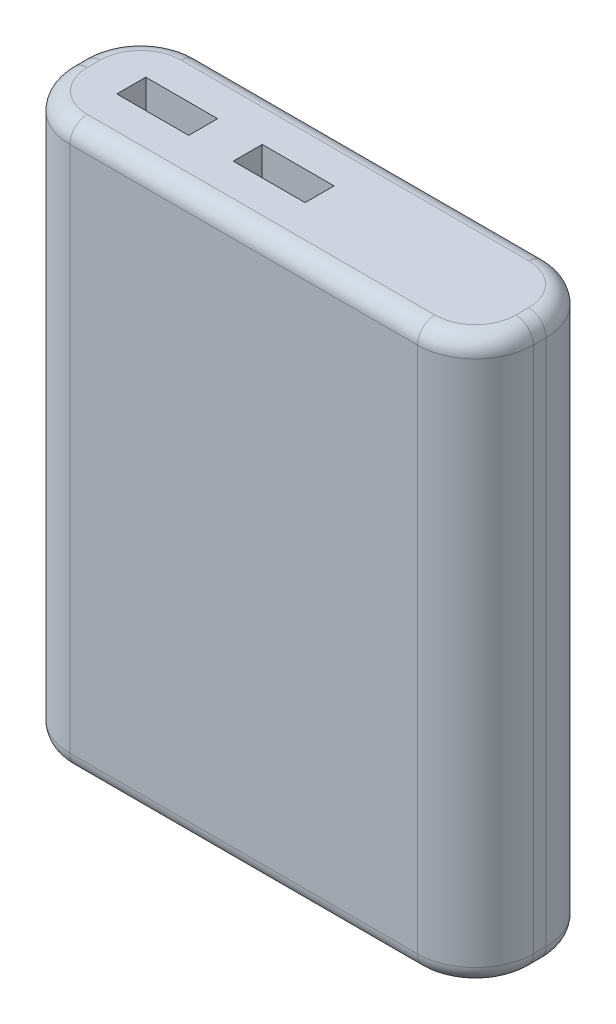
ISO-10303-21;
HEADER;
FILE_DESCRIPTION(('STEP AP214'),'2;1');
FILE_NAME('part.step','',(''),(''),'','','');
FILE_SCHEMA(('AUTOMOTIVE_DESIGN { 1 0 10303 214 1 1 1 1 }'));
ENDSEC;
DATA;
#1=APPLICATION_CONTEXT('core data for automotive mechanical design processes');
#2=APPLICATION_PROTOCOL_DEFINITION('international standard','automotive_design',2000,#1);
#3=PRODUCT_CONTEXT('',#1,'mechanical');
#4=PRODUCT('Part','Part','',(#3));
#5=PRODUCT_RELATED_PRODUCT_CATEGORY('part','',(#4));
#6=PRODUCT_DEFINITION_FORMATION('','',#4);
#7=PRODUCT_DEFINITION_CONTEXT('part definition',#1,'design');
#8=PRODUCT_DEFINITION('design','',#6,#7);
#9=PRODUCT_DEFINITION_SHAPE('','',#8);
#10=(LENGTH_UNIT() NAMED_UNIT(*) SI_UNIT(.MILLI.,.METRE.));
#11=(NAMED_UNIT(*) PLANE_ANGLE_UNIT() SI_UNIT($,.RADIAN.));
#12=(NAMED_UNIT(*) SI_UNIT($,.STERADIAN.) SOLID_ANGLE_UNIT());
#13=UNCERTAINTY_MEASURE_WITH_UNIT(LENGTH_MEASURE(1.E-05),#10,'distance_accuracy_value','');
#14=(GEOMETRIC_REPRESENTATION_CONTEXT(3) GLOBAL_UNCERTAINTY_ASSIGNED_CONTEXT((#13)) GLOBAL_UNIT_ASSIGNED_CONTEXT((#10,
#11,#12)) REPRESENTATION_CONTEXT('',''));
#15=CARTESIAN_POINT('',(0.,0.,0.));
#16=DIRECTION('',(0.,0.,1.));
#17=DIRECTION('',(1.,0.,0.));
#18=AXIS2_PLACEMENT_3D('',#15,#16,#17);
#19=CARTESIAN_POINT('',(30.,97.,1.1));
#20=DIRECTION('',(0.,-1.,0.));
#21=DIRECTION('',(0.,0.,-1.));
#22=AXIS2_PLACEMENT_3D('',#19,#20,#21);
#23=CYLINDRICAL_SURFACE('',#22,10.);
#24=DIRECTION('',(0.,-1.,0.));
#25=VECTOR('',#24,1.);
#26=CARTESIAN_POINT('',(40.,97.,1.09999999999993));
#27=LINE('',#26,#25);
#28=CARTESIAN_POINT('',(40.,94.,1.09999999999993));
#29=VERTEX_POINT('',#28);
#30=CARTESIAN_POINT('',(40.,3.00000000000002,1.09999999999993));
#31=VERTEX_POINT('',#30);
#32=EDGE_CURVE('E286',#29,#31,#27,.T.);
#33=ORIENTED_EDGE('',*,*,#32,.F.);
#34=CARTESIAN_POINT('',(30.,94.,1.1));
#35=DIRECTION('',(0.,1.,0.));
#36=DIRECTION('',(0.,0.,1.));
#37=AXIS2_PLACEMENT_3D('',#34,#35,#36);
#38=CIRCLE('',#37,10.);
#39=CARTESIAN_POINT('',(29.9999999999999,94.,11.1));
#40=VERTEX_POINT('',#39);
#41=EDGE_CURVE('E338',#29,#40,#38,.F.);
#42=ORIENTED_EDGE('',*,*,#41,.T.);
#43=DIRECTION('',(0.,-1.,0.));
#44=VECTOR('',#43,1.);
#45=CARTESIAN_POINT('',(29.9999999999999,97.,11.1));
#46=LINE('',#45,#44);
#47=CARTESIAN_POINT('',(29.9999999999999,3.00000000000002,11.1));
#48=VERTEX_POINT('',#47);
#49=EDGE_CURVE('E264',#40,#48,#46,.T.);
#50=ORIENTED_EDGE('',*,*,#49,.T.);
#51=CARTESIAN_POINT('',(30.,2.99999999999999,1.1));
#52=DIRECTION('',(0.,1.,0.));
#53=DIRECTION('',(0.,0.,1.));
#54=AXIS2_PLACEMENT_3D('',#51,#52,#53);
#55=CIRCLE('',#54,10.);
#56=EDGE_CURVE('E336',#48,#31,#55,.T.);
#57=ORIENTED_EDGE('',*,*,#56,.T.);
#58=EDGE_LOOP('',(#33,#42,#50,#57));
#59=FACE_BOUND('',#58,.T.);
#60=ADVANCED_FACE('F32',(#59),#23,.T.);
#61=CARTESIAN_POINT('',(40.,97.,-1.09999999999993));
#62=DIRECTION('',(-1.,0.,0.));
#63=DIRECTION('',(0.,0.,1.));
#64=AXIS2_PLACEMENT_3D('',#61,#62,#63);
#65=PLANE('',#64);
#66=DIRECTION('',(0.,-1.,0.));
#67=VECTOR('',#66,1.);
#68=CARTESIAN_POINT('',(40.,97.,-1.09999999999993));
#69=LINE('',#68,#67);
#70=CARTESIAN_POINT('',(40.,94.,-1.09999999999993));
#71=VERTEX_POINT('',#70);
#72=CARTESIAN_POINT('',(40.,3.00000000000002,-1.09999999999993));
#73=VERTEX_POINT('',#72);
#74=EDGE_CURVE('E283',#71,#73,#69,.T.);
#75=ORIENTED_EDGE('',*,*,#74,.F.);
#76=DIRECTION('',(0.,0.,-1.));
#77=VECTOR('',#76,1.);
#78=CARTESIAN_POINT('',(40.,94.,1.09999999999993));
#79=LINE('',#78,#77);
#80=EDGE_CURVE('E334',#71,#29,#79,.F.);
#81=ORIENTED_EDGE('',*,*,#80,.T.);
#82=ORIENTED_EDGE('',*,*,#32,.T.);
#83=DIRECTION('',(0.,0.,-1.));
#84=VECTOR('',#83,1.);
#85=CARTESIAN_POINT('',(40.,3.,-1.09999999999993));
#86=LINE('',#85,#84);
#87=EDGE_CURVE('E331',#31,#73,#86,.T.);
#88=ORIENTED_EDGE('',*,*,#87,.T.);
#89=EDGE_LOOP('',(#75,#81,#82,#88));
#90=FACE_BOUND('',#89,.T.);
#91=ADVANCED_FACE('F424',(#90),#65,.F.);
#92=CARTESIAN_POINT('',(30.,97.,-1.1));
#93=DIRECTION('',(0.,-1.,0.));
#94=DIRECTION('',(0.,0.,-1.));
#95=AXIS2_PLACEMENT_3D('',#92,#93,#94);
#96=CYLINDRICAL_SURFACE('',#95,10.);
#97=DIRECTION('',(0.,-1.,0.));
#98=VECTOR('',#97,1.);
#99=CARTESIAN_POINT('',(29.9999999999999,97.,-11.1));
#100=LINE('',#99,#98);
#101=CARTESIAN_POINT('',(29.9999999999999,94.,-11.1));
#102=VERTEX_POINT('',#101);
#103=CARTESIAN_POINT('',(29.9999999999999,3.00000000000003,-11.1));
#104=VERTEX_POINT('',#103);
#105=EDGE_CURVE('E280',#102,#104,#100,.T.);
#106=ORIENTED_EDGE('',*,*,#105,.F.);
#107=CARTESIAN_POINT('',(30.,94.,-1.1));
#108=DIRECTION('',(0.,1.,0.));
#109=DIRECTION('',(0.,0.,1.));
#110=AXIS2_PLACEMENT_3D('',#107,#108,#109);
#111=CIRCLE('',#110,10.);
#112=EDGE_CURVE('E329',#102,#71,#111,.F.);
#113=ORIENTED_EDGE('',*,*,#112,.T.);
#114=ORIENTED_EDGE('',*,*,#74,.T.);
#115=CARTESIAN_POINT('',(30.,2.99999999999999,-1.1));
#116=DIRECTION('',(0.,1.,0.));
#117=DIRECTION('',(0.,0.,1.));
#118=AXIS2_PLACEMENT_3D('',#115,#116,#117);
#119=CIRCLE('',#118,10.);
#120=EDGE_CURVE('E327',#73,#104,#119,.T.);
#121=ORIENTED_EDGE('',*,*,#120,.T.);
#122=EDGE_LOOP('',(#106,#113,#114,#121));
#123=FACE_BOUND('',#122,.T.);
#124=ADVANCED_FACE('F481',(#123),#96,.T.);
#125=CARTESIAN_POINT('',(-29.9999999999999,97.,-11.1));
#126=DIRECTION('',(0.,0.,1.));
#127=DIRECTION('',(1.,0.,0.));
#128=AXIS2_PLACEMENT_3D('',#125,#126,#127);
#129=PLANE('',#128);
#130=DIRECTION('',(0.,-1.,0.));
#131=VECTOR('',#130,1.);
#132=CARTESIAN_POINT('',(-29.9999999999999,97.,-11.1));
#133=LINE('',#132,#131);
#134=CARTESIAN_POINT('',(-29.9999999999999,94.,-11.1));
#135=VERTEX_POINT('',#134);
#136=CARTESIAN_POINT('',(-29.9999999999999,3.00000000000002,-11.1));
#137=VERTEX_POINT('',#136);
#138=EDGE_CURVE('E277',#135,#137,#133,.T.);
#139=ORIENTED_EDGE('',*,*,#138,.F.);
#140=DIRECTION('',(-1.,0.,0.));
#141=VECTOR('',#140,1.);
#142=CARTESIAN_POINT('',(29.9999999999999,94.,-11.1));
#143=LINE('',#142,#141);
#144=EDGE_CURVE('E325',#135,#102,#143,.F.);
#145=ORIENTED_EDGE('',*,*,#144,.T.);
#146=ORIENTED_EDGE('',*,*,#105,.T.);
#147=DIRECTION('',(-1.,0.,0.));
#148=VECTOR('',#147,1.);
#149=CARTESIAN_POINT('',(-29.9999999999999,3.,-11.1));
#150=LINE('',#149,#148);
#151=EDGE_CURVE('E323',#104,#137,#150,.T.);
#152=ORIENTED_EDGE('',*,*,#151,.T.);
#153=EDGE_LOOP('',(#139,#145,#146,#152));
#154=FACE_BOUND('',#153,.T.);
#155=ADVANCED_FACE('F469',(#154),#129,.F.);
#156=CARTESIAN_POINT('',(-30.,97.,-1.1));
#157=DIRECTION('',(0.,-1.,0.));
#158=DIRECTION('',(0.,0.,-1.));
#159=AXIS2_PLACEMENT_3D('',#156,#157,#158);
#160=CYLINDRICAL_SURFACE('',#159,10.);
#161=DIRECTION('',(0.,-1.,0.));
#162=VECTOR('',#161,1.);
#163=CARTESIAN_POINT('',(-40.,97.,-1.09999999999993));
#164=LINE('',#163,#162);
#165=CARTESIAN_POINT('',(-40.,94.,-1.09999999999993));
#166=VERTEX_POINT('',#165);
#167=CARTESIAN_POINT('',(-40.,3.00000000000003,-1.09999999999993));
#168=VERTEX_POINT('',#167);
#169=EDGE_CURVE('E274',#166,#168,#164,.T.);
#170=ORIENTED_EDGE('',*,*,#169,.F.);
#171=CARTESIAN_POINT('',(-30.,94.,-1.1));
#172=DIRECTION('',(0.,1.,0.));
#173=DIRECTION('',(0.,0.,1.));
#174=AXIS2_PLACEMENT_3D('',#171,#172,#173);
#175=CIRCLE('',#174,10.);
#176=EDGE_CURVE('E321',#166,#135,#175,.F.);
#177=ORIENTED_EDGE('',*,*,#176,.T.);
#178=ORIENTED_EDGE('',*,*,#138,.T.);
#179=CARTESIAN_POINT('',(-30.,2.99999999999999,-1.1));
#180=DIRECTION('',(0.,1.,0.));
#181=DIRECTION('',(0.,0.,1.));
#182=AXIS2_PLACEMENT_3D('',#179,#180,#181);
#183=CIRCLE('',#182,10.);
#184=EDGE_CURVE('E319',#137,#168,#183,.T.);
#185=ORIENTED_EDGE('',*,*,#184,.T.);
#186=EDGE_LOOP('',(#170,#177,#178,#185));
#187=FACE_BOUND('',#186,.T.);
#188=ADVANCED_FACE('F466',(#187),#160,.T.);
#189=CARTESIAN_POINT('',(-40.,97.,-1.09999999999993));
#190=DIRECTION('',(1.,0.,0.));
#191=DIRECTION('',(0.,0.,-1.));
#192=AXIS2_PLACEMENT_3D('',#189,#190,#191);
#193=PLANE('',#192);
#194=DIRECTION('',(0.,-1.,0.));
#195=VECTOR('',#194,1.);
#196=CARTESIAN_POINT('',(-40.,97.,1.09999999999993));
#197=LINE('',#196,#195);
#198=CARTESIAN_POINT('',(-40.,94.,1.09999999999993));
#199=VERTEX_POINT('',#198);
#200=CARTESIAN_POINT('',(-40.,3.00000000000002,1.09999999999993));
#201=VERTEX_POINT('',#200);
#202=EDGE_CURVE('E271',#199,#201,#197,.T.);
#203=ORIENTED_EDGE('',*,*,#202,.F.);
#204=DIRECTION('',(0.,0.,1.));
#205=VECTOR('',#204,1.);
#206=CARTESIAN_POINT('',(-40.,94.,-1.09999999999993));
#207=LINE('',#206,#205);
#208=EDGE_CURVE('E317',#199,#166,#207,.F.);
#209=ORIENTED_EDGE('',*,*,#208,.T.);
#210=ORIENTED_EDGE('',*,*,#169,.T.);
#211=DIRECTION('',(0.,0.,1.));
#212=VECTOR('',#211,1.);
#213=CARTESIAN_POINT('',(-40.,3.,-1.09999999999993));
#214=LINE('',#213,#212);
#215=EDGE_CURVE('E315',#168,#201,#214,.T.);
#216=ORIENTED_EDGE('',*,*,#215,.T.);
#217=EDGE_LOOP('',(#203,#209,#210,#216));
#218=FACE_BOUND('',#217,.T.);
#219=ADVANCED_FACE('F453',(#218),#193,.F.);
#220=CARTESIAN_POINT('',(-30.,97.,1.1));
#221=DIRECTION('',(0.,-1.,0.));
#222=DIRECTION('',(0.,0.,-1.));
#223=AXIS2_PLACEMENT_3D('',#220,#221,#222);
#224=CYLINDRICAL_SURFACE('',#223,10.);
#225=DIRECTION('',(0.,-1.,0.));
#226=VECTOR('',#225,1.);
#227=CARTESIAN_POINT('',(-29.9999999999999,97.,11.1));
#228=LINE('',#227,#226);
#229=CARTESIAN_POINT('',(-29.9999999999999,94.,11.1));
#230=VERTEX_POINT('',#229);
#231=CARTESIAN_POINT('',(-29.9999999999999,3.00000000000003,11.1));
#232=VERTEX_POINT('',#231);
#233=EDGE_CURVE('E267',#230,#232,#228,.T.);
#234=ORIENTED_EDGE('',*,*,#233,.F.);
#235=CARTESIAN_POINT('',(-30.,94.,1.1));
#236=DIRECTION('',(0.,1.,0.));
#237=DIRECTION('',(0.,0.,1.));
#238=AXIS2_PLACEMENT_3D('',#235,#236,#237);
#239=CIRCLE('',#238,10.);
#240=EDGE_CURVE('E313',#230,#199,#239,.F.);
#241=ORIENTED_EDGE('',*,*,#240,.T.);
#242=ORIENTED_EDGE('',*,*,#202,.T.);
#243=CARTESIAN_POINT('',(-30.,2.99999999999999,1.1));
#244=DIRECTION('',(0.,1.,0.));
#245=DIRECTION('',(0.,0.,1.));
#246=AXIS2_PLACEMENT_3D('',#243,#244,#245);
#247=CIRCLE('',#246,10.);
#248=EDGE_CURVE('E311',#201,#232,#247,.T.);
#249=ORIENTED_EDGE('',*,*,#248,.T.);
#250=EDGE_LOOP('',(#234,#241,#242,#249));
#251=FACE_BOUND('',#250,.T.);
#252=ADVANCED_FACE('F450',(#251),#224,.T.);
#253=CARTESIAN_POINT('',(-29.9999999999999,97.,11.1));
#254=DIRECTION('',(0.,0.,-1.));
#255=DIRECTION('',(-1.,0.,0.));
#256=AXIS2_PLACEMENT_3D('',#253,#254,#255);
#257=PLANE('',#256);
#258=ORIENTED_EDGE('',*,*,#49,.F.);
#259=DIRECTION('',(1.,0.,0.));
#260=VECTOR('',#259,1.);
#261=CARTESIAN_POINT('',(-29.9999999999999,94.,11.1));
#262=LINE('',#261,#260);
#263=EDGE_CURVE('E308',#40,#230,#262,.F.);
#264=ORIENTED_EDGE('',*,*,#263,.T.);
#265=ORIENTED_EDGE('',*,*,#233,.T.);
#266=DIRECTION('',(1.,0.,0.));
#267=VECTOR('',#266,1.);
#268=CARTESIAN_POINT('',(-29.9999999999999,3.,11.1));
#269=LINE('',#268,#267);
#270=EDGE_CURVE('E306',#232,#48,#269,.T.);
#271=ORIENTED_EDGE('',*,*,#270,.T.);
#272=EDGE_LOOP('',(#258,#264,#265,#271));
#273=FACE_BOUND('',#272,.T.);
#274=ADVANCED_FACE('F437',(#273),#257,.F.);
#275=CARTESIAN_POINT('',(30.,97.,1.1));
#276=DIRECTION('',(0.,1.,0.));
#277=DIRECTION('',(0.,0.,1.));
#278=AXIS2_PLACEMENT_3D('',#275,#276,#277);
#279=PLANE('',#278);
#280=DIRECTION('',(0.,0.,-1.));
#281=VECTOR('',#280,1.);
#282=CARTESIAN_POINT('',(-18.1,97.,-2.49999999999999));
#283=LINE('',#282,#281);
#284=CARTESIAN_POINT('',(-18.1,97.,2.50000000000001));
#285=VERTEX_POINT('',#284);
#286=CARTESIAN_POINT('',(-18.1,97.,-2.49999999999999));
#287=VERTEX_POINT('',#286);
#288=EDGE_CURVE('E49',#285,#287,#283,.T.);
#289=ORIENTED_EDGE('',*,*,#288,.F.);
#290=DIRECTION('',(1.,0.,0.));
#291=VECTOR('',#290,1.);
#292=CARTESIAN_POINT('',(-30.5,97.,2.50000000000001));
#293=LINE('',#292,#291);
#294=CARTESIAN_POINT('',(-30.5,97.,2.50000000000001));
#295=VERTEX_POINT('',#294);
#296=EDGE_CURVE('E215',#295,#285,#293,.T.);
#297=ORIENTED_EDGE('',*,*,#296,.F.);
#298=DIRECTION('',(0.,0.,1.));
#299=VECTOR('',#298,1.);
#300=CARTESIAN_POINT('',(-30.5,97.,-2.49999999999999));
#301=LINE('',#300,#299);
#302=CARTESIAN_POINT('',(-30.5,97.,-2.49999999999999));
#303=VERTEX_POINT('',#302);
#304=EDGE_CURVE('E218',#303,#295,#301,.T.);
#305=ORIENTED_EDGE('',*,*,#304,.F.);
#306=DIRECTION('',(-1.,0.,0.));
#307=VECTOR('',#306,1.);
#308=CARTESIAN_POINT('',(-30.5,97.,-2.49999999999999));
#309=LINE('',#308,#307);
#310=EDGE_CURVE('E224',#287,#303,#309,.T.);
#311=ORIENTED_EDGE('',*,*,#310,.F.);
#312=EDGE_LOOP('',(#289,#297,#305,#311));
#313=FACE_BOUND('',#312,.T.);
#314=DIRECTION('',(0.,0.,-1.));
#315=VECTOR('',#314,1.);
#316=CARTESIAN_POINT('',(2.,97.,-2.5));
#317=LINE('',#316,#315);
#318=CARTESIAN_POINT('',(2.,97.,2.5));
#319=VERTEX_POINT('',#318);
#320=CARTESIAN_POINT('',(2.,97.,-2.5));
#321=VERTEX_POINT('',#320);
#322=EDGE_CURVE('E57',#319,#321,#317,.T.);
#323=ORIENTED_EDGE('',*,*,#322,.F.);
#324=DIRECTION('',(1.,0.,0.));
#325=VECTOR('',#324,1.);
#326=CARTESIAN_POINT('',(-10.4,97.,2.5));
#327=LINE('',#326,#325);
#328=CARTESIAN_POINT('',(-10.4,97.,2.5));
#329=VERTEX_POINT('',#328);
#330=EDGE_CURVE('E239',#329,#319,#327,.T.);
#331=ORIENTED_EDGE('',*,*,#330,.F.);
#332=DIRECTION('',(0.,0.,1.));
#333=VECTOR('',#332,1.);
#334=CARTESIAN_POINT('',(-10.4,97.,-2.5));
#335=LINE('',#334,#333);
#336=CARTESIAN_POINT('',(-10.4,97.,-2.5));
#337=VERTEX_POINT('',#336);
#338=EDGE_CURVE('E253',#337,#329,#335,.T.);
#339=ORIENTED_EDGE('',*,*,#338,.F.);
#340=DIRECTION('',(-1.,0.,0.));
#341=VECTOR('',#340,1.);
#342=CARTESIAN_POINT('',(-10.4,97.,-2.5));
#343=LINE('',#342,#341);
#344=EDGE_CURVE('E250',#321,#337,#343,.T.);
#345=ORIENTED_EDGE('',*,*,#344,.F.);
#346=EDGE_LOOP('',(#323,#331,#339,#345));
#347=FACE_BOUND('',#346,.T.);
#348=CARTESIAN_POINT('',(-30.,97.,1.1));
#349=DIRECTION('',(0.,1.,0.));
#350=DIRECTION('',(0.,0.,1.));
#351=AXIS2_PLACEMENT_3D('',#348,#349,#350);
#352=CIRCLE('',#351,7.);
#353=CARTESIAN_POINT('',(-37.,97.,1.09999999999995));
#354=VERTEX_POINT('',#353);
#355=CARTESIAN_POINT('',(-29.9999999999999,97.,8.1));
#356=VERTEX_POINT('',#355);
#357=EDGE_CURVE('E301',#354,#356,#352,.T.);
#358=ORIENTED_EDGE('',*,*,#357,.T.);
#359=DIRECTION('',(1.,0.,0.));
#360=VECTOR('',#359,1.);
#361=CARTESIAN_POINT('',(29.9999999999999,97.,8.1));
#362=LINE('',#361,#360);
#363=CARTESIAN_POINT('',(29.9999999999999,97.,8.1));
#364=VERTEX_POINT('',#363);
#365=EDGE_CURVE('E303',#356,#364,#362,.T.);
#366=ORIENTED_EDGE('',*,*,#365,.T.);
#367=CARTESIAN_POINT('',(30.,97.,1.1));
#368=DIRECTION('',(0.,1.,0.));
#369=DIRECTION('',(0.,0.,1.));
#370=AXIS2_PLACEMENT_3D('',#367,#368,#369);
#371=CIRCLE('',#370,7.);
#372=CARTESIAN_POINT('',(37.,97.,1.09999999999993));
#373=VERTEX_POINT('',#372);
#374=EDGE_CURVE('E289',#364,#373,#371,.T.);
#375=ORIENTED_EDGE('',*,*,#374,.T.);
#376=DIRECTION('',(0.,0.,-1.));
#377=VECTOR('',#376,1.);
#378=CARTESIAN_POINT('',(37.,97.,-1.09999999999993));
#379=LINE('',#378,#377);
#380=CARTESIAN_POINT('',(37.,97.,-1.09999999999995));
#381=VERTEX_POINT('',#380);
#382=EDGE_CURVE('E291',#373,#381,#379,.T.);
#383=ORIENTED_EDGE('',*,*,#382,.T.);
#384=CARTESIAN_POINT('',(30.,97.,-1.1));
#385=DIRECTION('',(0.,1.,0.));
#386=DIRECTION('',(0.,0.,1.));
#387=AXIS2_PLACEMENT_3D('',#384,#385,#386);
#388=CIRCLE('',#387,7.);
#389=CARTESIAN_POINT('',(29.9999999999999,97.,-8.1));
#390=VERTEX_POINT('',#389);
#391=EDGE_CURVE('E293',#381,#390,#388,.T.);
#392=ORIENTED_EDGE('',*,*,#391,.T.);
#393=DIRECTION('',(-1.,0.,0.));
#394=VECTOR('',#393,1.);
#395=CARTESIAN_POINT('',(-29.9999999999999,97.,-8.1));
#396=LINE('',#395,#394);
#397=CARTESIAN_POINT('',(-30.,97.,-8.1));
#398=VERTEX_POINT('',#397);
#399=EDGE_CURVE('E295',#390,#398,#396,.T.);
#400=ORIENTED_EDGE('',*,*,#399,.T.);
#401=CARTESIAN_POINT('',(-30.,97.,-1.1));
#402=DIRECTION('',(0.,1.,0.));
#403=DIRECTION('',(0.,0.,1.));
#404=AXIS2_PLACEMENT_3D('',#401,#402,#403);
#405=CIRCLE('',#404,7.);
#406=CARTESIAN_POINT('',(-37.,97.,-1.09999999999993));
#407=VERTEX_POINT('',#406);
#408=EDGE_CURVE('E297',#398,#407,#405,.T.);
#409=ORIENTED_EDGE('',*,*,#408,.T.);
#410=DIRECTION('',(0.,0.,1.));
#411=VECTOR('',#410,1.);
#412=CARTESIAN_POINT('',(-37.,97.,1.09999999999993));
#413=LINE('',#412,#411);
#414=EDGE_CURVE('E299',#407,#354,#413,.T.);
#415=ORIENTED_EDGE('',*,*,#414,.T.);
#416=EDGE_LOOP('',(#358,#366,#375,#383,#392,#400,#409,#415));
#417=FACE_BOUND('',#416,.T.);
#418=ADVANCED_FACE('F530',(#313,#347,#417),#279,.T.);
#419=CARTESIAN_POINT('',(30.,0.,1.1));
#420=DIRECTION('',(0.,1.,0.));
#421=DIRECTION('',(0.,0.,1.));
#422=AXIS2_PLACEMENT_3D('',#419,#420,#421);
#423=PLANE('',#422);
#424=CARTESIAN_POINT('',(30.,0.,-1.1));
#425=DIRECTION('',(0.,1.,0.));
#426=DIRECTION('',(0.,0.,1.));
#427=AXIS2_PLACEMENT_3D('',#424,#425,#426);
#428=CIRCLE('',#427,7.);
#429=CARTESIAN_POINT('',(30.,0.,-8.1));
#430=VERTEX_POINT('',#429);
#431=CARTESIAN_POINT('',(37.,0.,-1.09999999999993));
#432=VERTEX_POINT('',#431);
#433=EDGE_CURVE('E41',#430,#432,#428,.F.);
#434=ORIENTED_EDGE('',*,*,#433,.T.);
#435=DIRECTION('',(0.,0.,-1.));
#436=VECTOR('',#435,1.);
#437=CARTESIAN_POINT('',(37.,0.,1.1));
#438=LINE('',#437,#436);
#439=CARTESIAN_POINT('',(37.,0.,1.09999999999993));
#440=VERTEX_POINT('',#439);
#441=EDGE_CURVE('E11',#432,#440,#438,.F.);
#442=ORIENTED_EDGE('',*,*,#441,.T.);
#443=CARTESIAN_POINT('',(30.,0.,1.1));
#444=DIRECTION('',(0.,1.,0.));
#445=DIRECTION('',(0.,0.,1.));
#446=AXIS2_PLACEMENT_3D('',#443,#444,#445);
#447=CIRCLE('',#446,7.);
#448=CARTESIAN_POINT('',(29.9999999999999,0.,8.1));
#449=VERTEX_POINT('',#448);
#450=EDGE_CURVE('E340',#440,#449,#447,.F.);
#451=ORIENTED_EDGE('',*,*,#450,.T.);
#452=DIRECTION('',(1.,0.,0.));
#453=VECTOR('',#452,1.);
#454=CARTESIAN_POINT('',(30.,0.,8.1));
#455=LINE('',#454,#453);
#456=CARTESIAN_POINT('',(-30.,0.,8.1));
#457=VERTEX_POINT('',#456);
#458=EDGE_CURVE('E342',#449,#457,#455,.F.);
#459=ORIENTED_EDGE('',*,*,#458,.T.);
#460=CARTESIAN_POINT('',(-30.,0.,1.1));
#461=DIRECTION('',(0.,1.,0.));
#462=DIRECTION('',(0.,0.,1.));
#463=AXIS2_PLACEMENT_3D('',#460,#461,#462);
#464=CIRCLE('',#463,7.);
#465=CARTESIAN_POINT('',(-37.,0.,1.09999999999993));
#466=VERTEX_POINT('',#465);
#467=EDGE_CURVE('E344',#457,#466,#464,.F.);
#468=ORIENTED_EDGE('',*,*,#467,.T.);
#469=DIRECTION('',(0.,0.,1.));
#470=VECTOR('',#469,1.);
#471=CARTESIAN_POINT('',(-37.,0.,1.1));
#472=LINE('',#471,#470);
#473=CARTESIAN_POINT('',(-37.,0.,-1.09999999999995));
#474=VERTEX_POINT('',#473);
#475=EDGE_CURVE('E346',#466,#474,#472,.F.);
#476=ORIENTED_EDGE('',*,*,#475,.T.);
#477=CARTESIAN_POINT('',(-30.,0.,-1.1));
#478=DIRECTION('',(0.,1.,0.));
#479=DIRECTION('',(0.,0.,1.));
#480=AXIS2_PLACEMENT_3D('',#477,#478,#479);
#481=CIRCLE('',#480,7.);
#482=CARTESIAN_POINT('',(-29.9999999999999,0.,-8.1));
#483=VERTEX_POINT('',#482);
#484=EDGE_CURVE('E348',#474,#483,#481,.F.);
#485=ORIENTED_EDGE('',*,*,#484,.T.);
#486=DIRECTION('',(-1.,0.,0.));
#487=VECTOR('',#486,1.);
#488=CARTESIAN_POINT('',(30.,0.,-8.1));
#489=LINE('',#488,#487);
#490=EDGE_CURVE('E350',#483,#430,#489,.F.);
#491=ORIENTED_EDGE('',*,*,#490,.T.);
#492=EDGE_LOOP('',(#434,#442,#451,#459,#468,#476,#485,#491));
#493=FACE_BOUND('',#492,.T.);
#494=ADVANCED_FACE('F405',(#493),#423,.F.);
#495=CARTESIAN_POINT('',(30.,94.,-8.1));
#496=DIRECTION('',(1.,0.,0.));
#497=DIRECTION('',(0.,0.,-1.));
#498=AXIS2_PLACEMENT_3D('',#495,#496,#497);
#499=CYLINDRICAL_SURFACE('',#498,3.);
#500=CARTESIAN_POINT('',(29.9999999999999,94.,-8.1));
#501=DIRECTION('',(1.,0.,0.));
#502=DIRECTION('',(0.,0.,-1.));
#503=AXIS2_PLACEMENT_3D('',#500,#501,#502);
#504=CIRCLE('',#503,3.);
#505=EDGE_CURVE('E369',#102,#390,#504,.T.);
#506=ORIENTED_EDGE('',*,*,#505,.F.);
#507=ORIENTED_EDGE('',*,*,#144,.F.);
#508=CARTESIAN_POINT('',(-30.,94.,-8.1));
#509=DIRECTION('',(-1.,0.,0.));
#510=DIRECTION('',(0.,0.,1.));
#511=AXIS2_PLACEMENT_3D('',#508,#509,#510);
#512=CIRCLE('',#511,3.);
#513=EDGE_CURVE('E268',#398,#135,#512,.T.);
#514=ORIENTED_EDGE('',*,*,#513,.F.);
#515=ORIENTED_EDGE('',*,*,#399,.F.);
#516=EDGE_LOOP('',(#506,#507,#514,#515));
#517=FACE_BOUND('',#516,.T.);
#518=ADVANCED_FACE('F474',(#517),#499,.T.);
#519=CARTESIAN_POINT('',(-30.,94.,-1.1));
#520=DIRECTION('',(0.,1.,0.));
#521=DIRECTION('',(0.,0.,1.));
#522=AXIS2_PLACEMENT_3D('',#519,#520,#521);
#523=TOROIDAL_SURFACE('',#522,7.,3.);
#524=ORIENTED_EDGE('',*,*,#513,.T.);
#525=ORIENTED_EDGE('',*,*,#176,.F.);
#526=CARTESIAN_POINT('',(-37.,94.,-1.09999999999993));
#527=DIRECTION('',(0.,0.,1.));
#528=DIRECTION('',(1.,0.,0.));
#529=AXIS2_PLACEMENT_3D('',#526,#527,#528);
#530=CIRCLE('',#529,3.);
#531=EDGE_CURVE('E366',#407,#166,#530,.T.);
#532=ORIENTED_EDGE('',*,*,#531,.F.);
#533=ORIENTED_EDGE('',*,*,#408,.F.);
#534=EDGE_LOOP('',(#524,#525,#532,#533));
#535=FACE_BOUND('',#534,.T.);
#536=ADVANCED_FACE('F462',(#535),#523,.T.);
#537=CARTESIAN_POINT('',(30.,94.,-1.1));
#538=DIRECTION('',(0.,1.,0.));
#539=DIRECTION('',(0.,0.,1.));
#540=AXIS2_PLACEMENT_3D('',#537,#538,#539);
#541=TOROIDAL_SURFACE('',#540,7.,3.);
#542=ORIENTED_EDGE('',*,*,#505,.T.);
#543=ORIENTED_EDGE('',*,*,#391,.F.);
#544=CARTESIAN_POINT('',(37.,94.,-1.09999999999995));
#545=DIRECTION('',(0.,0.,1.));
#546=DIRECTION('',(1.,0.,0.));
#547=AXIS2_PLACEMENT_3D('',#544,#545,#546);
#548=CIRCLE('',#547,3.);
#549=EDGE_CURVE('E363',#71,#381,#548,.T.);
#550=ORIENTED_EDGE('',*,*,#549,.F.);
#551=ORIENTED_EDGE('',*,*,#112,.F.);
#552=EDGE_LOOP('',(#542,#543,#550,#551));
#553=FACE_BOUND('',#552,.T.);
#554=ADVANCED_FACE('F479',(#553),#541,.T.);
#555=CARTESIAN_POINT('',(-37.,94.,1.1));
#556=DIRECTION('',(0.,0.,-1.));
#557=DIRECTION('',(-1.,0.,0.));
#558=AXIS2_PLACEMENT_3D('',#555,#556,#557);
#559=CYLINDRICAL_SURFACE('',#558,3.);
#560=ORIENTED_EDGE('',*,*,#531,.T.);
#561=ORIENTED_EDGE('',*,*,#208,.F.);
#562=CARTESIAN_POINT('',(-37.,94.,1.09999999999995));
#563=DIRECTION('',(0.,0.,1.));
#564=DIRECTION('',(1.,0.,0.));
#565=AXIS2_PLACEMENT_3D('',#562,#563,#564);
#566=CIRCLE('',#565,3.);
#567=EDGE_CURVE('E360',#354,#199,#566,.T.);
#568=ORIENTED_EDGE('',*,*,#567,.F.);
#569=ORIENTED_EDGE('',*,*,#414,.F.);
#570=EDGE_LOOP('',(#560,#561,#568,#569));
#571=FACE_BOUND('',#570,.T.);
#572=ADVANCED_FACE('F456',(#571),#559,.T.);
#573=CARTESIAN_POINT('',(37.,94.,1.1));
#574=DIRECTION('',(0.,0.,1.));
#575=DIRECTION('',(1.,0.,0.));
#576=AXIS2_PLACEMENT_3D('',#573,#574,#575);
#577=CYLINDRICAL_SURFACE('',#576,3.);
#578=ORIENTED_EDGE('',*,*,#549,.T.);
#579=ORIENTED_EDGE('',*,*,#382,.F.);
#580=CARTESIAN_POINT('',(37.,94.,1.09999999999993));
#581=DIRECTION('',(0.,0.,1.));
#582=DIRECTION('',(1.,0.,0.));
#583=AXIS2_PLACEMENT_3D('',#580,#581,#582);
#584=CIRCLE('',#583,3.);
#585=EDGE_CURVE('E357',#29,#373,#584,.T.);
#586=ORIENTED_EDGE('',*,*,#585,.F.);
#587=ORIENTED_EDGE('',*,*,#80,.F.);
#588=EDGE_LOOP('',(#578,#579,#586,#587));
#589=FACE_BOUND('',#588,.T.);
#590=ADVANCED_FACE('F428',(#589),#577,.T.);
#591=CARTESIAN_POINT('',(-30.,94.,1.1));
#592=DIRECTION('',(0.,1.,0.));
#593=DIRECTION('',(0.,0.,1.));
#594=AXIS2_PLACEMENT_3D('',#591,#592,#593);
#595=TOROIDAL_SURFACE('',#594,7.,3.);
#596=ORIENTED_EDGE('',*,*,#567,.T.);
#597=ORIENTED_EDGE('',*,*,#240,.F.);
#598=CARTESIAN_POINT('',(-29.9999999999999,94.,8.1));
#599=DIRECTION('',(1.,0.,0.));
#600=DIRECTION('',(0.,0.,-1.));
#601=AXIS2_PLACEMENT_3D('',#598,#599,#600);
#602=CIRCLE('',#601,3.);
#603=EDGE_CURVE('E355',#356,#230,#602,.T.);
#604=ORIENTED_EDGE('',*,*,#603,.F.);
#605=ORIENTED_EDGE('',*,*,#357,.F.);
#606=EDGE_LOOP('',(#596,#597,#604,#605));
#607=FACE_BOUND('',#606,.T.);
#608=ADVANCED_FACE('F446',(#607),#595,.T.);
#609=CARTESIAN_POINT('',(30.,94.,1.1));
#610=DIRECTION('',(0.,1.,0.));
#611=DIRECTION('',(0.,0.,1.));
#612=AXIS2_PLACEMENT_3D('',#609,#610,#611);
#613=TOROIDAL_SURFACE('',#612,7.,3.);
#614=ORIENTED_EDGE('',*,*,#585,.T.);
#615=ORIENTED_EDGE('',*,*,#374,.F.);
#616=CARTESIAN_POINT('',(30.,94.,8.1));
#617=DIRECTION('',(-1.,0.,0.));
#618=DIRECTION('',(0.,0.,1.));
#619=AXIS2_PLACEMENT_3D('',#616,#617,#618);
#620=CIRCLE('',#619,3.);
#621=EDGE_CURVE('E353',#40,#364,#620,.T.);
#622=ORIENTED_EDGE('',*,*,#621,.F.);
#623=ORIENTED_EDGE('',*,*,#41,.F.);
#624=EDGE_LOOP('',(#614,#615,#622,#623));
#625=FACE_BOUND('',#624,.T.);
#626=ADVANCED_FACE('F434',(#625),#613,.T.);
#627=CARTESIAN_POINT('',(30.,94.,8.1));
#628=DIRECTION('',(-1.,0.,0.));
#629=DIRECTION('',(0.,0.,1.));
#630=AXIS2_PLACEMENT_3D('',#627,#628,#629);
#631=CYLINDRICAL_SURFACE('',#630,3.);
#632=ORIENTED_EDGE('',*,*,#603,.T.);
#633=ORIENTED_EDGE('',*,*,#263,.F.);
#634=ORIENTED_EDGE('',*,*,#621,.T.);
#635=ORIENTED_EDGE('',*,*,#365,.F.);
#636=EDGE_LOOP('',(#632,#633,#634,#635));
#637=FACE_BOUND('',#636,.T.);
#638=ADVANCED_FACE('F440',(#637),#631,.T.);
#639=CARTESIAN_POINT('',(-37.,3.,-1.09999999999993));
#640=DIRECTION('',(0.,0.,1.));
#641=DIRECTION('',(1.,0.,0.));
#642=AXIS2_PLACEMENT_3D('',#639,#640,#641);
#643=CYLINDRICAL_SURFACE('',#642,3.);
#644=CARTESIAN_POINT('',(-37.,3.,-1.09999999999995));
#645=DIRECTION('',(0.,0.,-1.));
#646=DIRECTION('',(-1.,0.,0.));
#647=AXIS2_PLACEMENT_3D('',#644,#645,#646);
#648=CIRCLE('',#647,3.);
#649=EDGE_CURVE('E388',#474,#168,#648,.T.);
#650=ORIENTED_EDGE('',*,*,#649,.F.);
#651=ORIENTED_EDGE('',*,*,#475,.F.);
#652=CARTESIAN_POINT('',(-37.,3.,1.09999999999993));
#653=DIRECTION('',(0.,0.,1.));
#654=DIRECTION('',(1.,0.,0.));
#655=AXIS2_PLACEMENT_3D('',#652,#653,#654);
#656=CIRCLE('',#655,3.);
#657=EDGE_CURVE('E36',#201,#466,#656,.T.);
#658=ORIENTED_EDGE('',*,*,#657,.F.);
#659=ORIENTED_EDGE('',*,*,#215,.F.);
#660=EDGE_LOOP('',(#650,#651,#658,#659));
#661=FACE_BOUND('',#660,.T.);
#662=ADVANCED_FACE('F34',(#661),#643,.T.);
#663=CARTESIAN_POINT('',(-30.,3.,1.1));
#664=DIRECTION('',(0.,1.,0.));
#665=DIRECTION('',(0.,0.,1.));
#666=AXIS2_PLACEMENT_3D('',#663,#664,#665);
#667=TOROIDAL_SURFACE('',#666,7.,3.);
#668=ORIENTED_EDGE('',*,*,#657,.T.);
#669=ORIENTED_EDGE('',*,*,#467,.F.);
#670=CARTESIAN_POINT('',(-30.,3.,8.1));
#671=DIRECTION('',(1.,0.,0.));
#672=DIRECTION('',(0.,0.,-1.));
#673=AXIS2_PLACEMENT_3D('',#670,#671,#672);
#674=CIRCLE('',#673,3.);
#675=EDGE_CURVE('E386',#232,#457,#674,.T.);
#676=ORIENTED_EDGE('',*,*,#675,.F.);
#677=ORIENTED_EDGE('',*,*,#248,.F.);
#678=EDGE_LOOP('',(#668,#669,#676,#677));
#679=FACE_BOUND('',#678,.T.);
#680=ADVANCED_FACE('F399',(#679),#667,.T.);
#681=CARTESIAN_POINT('',(-30.,3.,-1.1));
#682=DIRECTION('',(0.,1.,0.));
#683=DIRECTION('',(0.,0.,1.));
#684=AXIS2_PLACEMENT_3D('',#681,#682,#683);
#685=TOROIDAL_SURFACE('',#684,7.,3.);
#686=ORIENTED_EDGE('',*,*,#649,.T.);
#687=ORIENTED_EDGE('',*,*,#184,.F.);
#688=CARTESIAN_POINT('',(-29.9999999999999,3.,-8.1));
#689=DIRECTION('',(1.,0.,0.));
#690=DIRECTION('',(0.,0.,-1.));
#691=AXIS2_PLACEMENT_3D('',#688,#689,#690);
#692=CIRCLE('',#691,3.);
#693=EDGE_CURVE('E383',#483,#137,#692,.T.);
#694=ORIENTED_EDGE('',*,*,#693,.F.);
#695=ORIENTED_EDGE('',*,*,#484,.F.);
#696=EDGE_LOOP('',(#686,#687,#694,#695));
#697=FACE_BOUND('',#696,.T.);
#698=ADVANCED_FACE('F710',(#697),#685,.T.);
#699=CARTESIAN_POINT('',(-29.9999999999999,3.,8.1));
#700=DIRECTION('',(1.,0.,0.));
#701=DIRECTION('',(0.,0.,-1.));
#702=AXIS2_PLACEMENT_3D('',#699,#700,#701);
#703=CYLINDRICAL_SURFACE('',#702,3.);
#704=ORIENTED_EDGE('',*,*,#675,.T.);
#705=ORIENTED_EDGE('',*,*,#458,.F.);
#706=CARTESIAN_POINT('',(29.9999999999999,3.,8.1));
#707=DIRECTION('',(1.,0.,0.));
#708=DIRECTION('',(0.,0.,-1.));
#709=AXIS2_PLACEMENT_3D('',#706,#707,#708);
#710=CIRCLE('',#709,3.);
#711=EDGE_CURVE('E380',#48,#449,#710,.T.);
#712=ORIENTED_EDGE('',*,*,#711,.F.);
#713=ORIENTED_EDGE('',*,*,#270,.F.);
#714=EDGE_LOOP('',(#704,#705,#712,#713));
#715=FACE_BOUND('',#714,.T.);
#716=ADVANCED_FACE('F411',(#715),#703,.T.);
#717=CARTESIAN_POINT('',(-29.9999999999999,3.,-8.1));
#718=DIRECTION('',(-1.,0.,0.));
#719=DIRECTION('',(0.,0.,1.));
#720=AXIS2_PLACEMENT_3D('',#717,#718,#719);
#721=CYLINDRICAL_SURFACE('',#720,3.);
#722=ORIENTED_EDGE('',*,*,#693,.T.);
#723=ORIENTED_EDGE('',*,*,#151,.F.);
#724=CARTESIAN_POINT('',(30.,3.,-8.1));
#725=DIRECTION('',(1.,0.,0.));
#726=DIRECTION('',(0.,0.,-1.));
#727=AXIS2_PLACEMENT_3D('',#724,#725,#726);
#728=CIRCLE('',#727,3.);
#729=EDGE_CURVE('E377',#430,#104,#728,.T.);
#730=ORIENTED_EDGE('',*,*,#729,.F.);
#731=ORIENTED_EDGE('',*,*,#490,.F.);
#732=EDGE_LOOP('',(#722,#723,#730,#731));
#733=FACE_BOUND('',#732,.T.);
#734=ADVANCED_FACE('F485',(#733),#721,.T.);
#735=CARTESIAN_POINT('',(30.,3.,1.1));
#736=DIRECTION('',(0.,1.,0.));
#737=DIRECTION('',(0.,0.,1.));
#738=AXIS2_PLACEMENT_3D('',#735,#736,#737);
#739=TOROIDAL_SURFACE('',#738,7.,3.);
#740=ORIENTED_EDGE('',*,*,#711,.T.);
#741=ORIENTED_EDGE('',*,*,#450,.F.);
#742=CARTESIAN_POINT('',(37.,3.,1.09999999999995));
#743=DIRECTION('',(0.,0.,-1.));
#744=DIRECTION('',(0.,1.,0.));
#745=AXIS2_PLACEMENT_3D('',#742,#743,#744);
#746=CIRCLE('',#745,3.);
#747=EDGE_CURVE('E375',#31,#440,#746,.T.);
#748=ORIENTED_EDGE('',*,*,#747,.F.);
#749=ORIENTED_EDGE('',*,*,#56,.F.);
#750=EDGE_LOOP('',(#740,#741,#748,#749));
#751=FACE_BOUND('',#750,.T.);
#752=ADVANCED_FACE('F415',(#751),#739,.T.);
#753=CARTESIAN_POINT('',(30.,3.,-1.1));
#754=DIRECTION('',(0.,1.,0.));
#755=DIRECTION('',(0.,0.,1.));
#756=AXIS2_PLACEMENT_3D('',#753,#754,#755);
#757=TOROIDAL_SURFACE('',#756,7.,3.);
#758=ORIENTED_EDGE('',*,*,#729,.T.);
#759=ORIENTED_EDGE('',*,*,#120,.F.);
#760=CARTESIAN_POINT('',(37.,3.,-1.09999999999993));
#761=DIRECTION('',(0.,0.,1.));
#762=DIRECTION('',(1.,0.,0.));
#763=AXIS2_PLACEMENT_3D('',#760,#761,#762);
#764=CIRCLE('',#763,3.);
#765=EDGE_CURVE('E231',#432,#73,#764,.T.);
#766=ORIENTED_EDGE('',*,*,#765,.F.);
#767=ORIENTED_EDGE('',*,*,#433,.F.);
#768=EDGE_LOOP('',(#758,#759,#766,#767));
#769=FACE_BOUND('',#768,.T.);
#770=ADVANCED_FACE('F489',(#769),#757,.T.);
#771=CARTESIAN_POINT('',(37.,3.,-1.09999999999993));
#772=DIRECTION('',(0.,0.,-1.));
#773=DIRECTION('',(-1.,0.,0.));
#774=AXIS2_PLACEMENT_3D('',#771,#772,#773);
#775=CYLINDRICAL_SURFACE('',#774,3.);
#776=ORIENTED_EDGE('',*,*,#747,.T.);
#777=ORIENTED_EDGE('',*,*,#441,.F.);
#778=ORIENTED_EDGE('',*,*,#765,.T.);
#779=ORIENTED_EDGE('',*,*,#87,.F.);
#780=EDGE_LOOP('',(#776,#777,#778,#779));
#781=FACE_BOUND('',#780,.T.);
#782=ADVANCED_FACE('F493',(#781),#775,.T.);
#783=CARTESIAN_POINT('',(2.,87.,-2.5));
#784=DIRECTION('',(1.,0.,0.));
#785=DIRECTION('',(0.,0.,-1.));
#786=AXIS2_PLACEMENT_3D('',#783,#784,#785);
#787=PLANE('',#786);
#788=ORIENTED_EDGE('',*,*,#322,.T.);
#789=DIRECTION('',(0.,1.,0.));
#790=VECTOR('',#789,1.);
#791=CARTESIAN_POINT('',(2.,87.,-2.5));
#792=LINE('',#791,#790);
#793=CARTESIAN_POINT('',(2.,87.,-2.5));
#794=VERTEX_POINT('',#793);
#795=EDGE_CURVE('E248',#794,#321,#792,.T.);
#796=ORIENTED_EDGE('',*,*,#795,.F.);
#797=DIRECTION('',(0.,0.,-1.));
#798=VECTOR('',#797,1.);
#799=CARTESIAN_POINT('',(2.,87.,-2.5));
#800=LINE('',#799,#798);
#801=CARTESIAN_POINT('',(2.,87.,2.5));
#802=VERTEX_POINT('',#801);
#803=EDGE_CURVE('E235',#802,#794,#800,.T.);
#804=ORIENTED_EDGE('',*,*,#803,.F.);
#805=DIRECTION('',(0.,1.,0.));
#806=VECTOR('',#805,1.);
#807=CARTESIAN_POINT('',(2.,87.,2.5));
#808=LINE('',#807,#806);
#809=EDGE_CURVE('E225',#802,#319,#808,.T.);
#810=ORIENTED_EDGE('',*,*,#809,.T.);
#811=EDGE_LOOP('',(#788,#796,#804,#810));
#812=FACE_BOUND('',#811,.T.);
#813=ADVANCED_FACE('F495',(#812),#787,.F.);
#814=CARTESIAN_POINT('',(-10.4,87.,2.5));
#815=DIRECTION('',(0.,0.,1.));
#816=DIRECTION('',(1.,0.,0.));
#817=AXIS2_PLACEMENT_3D('',#814,#815,#816);
#818=PLANE('',#817);
#819=ORIENTED_EDGE('',*,*,#330,.T.);
#820=ORIENTED_EDGE('',*,*,#809,.F.);
#821=DIRECTION('',(1.,0.,0.));
#822=VECTOR('',#821,1.);
#823=CARTESIAN_POINT('',(-10.4,87.,2.5));
#824=LINE('',#823,#822);
#825=CARTESIAN_POINT('',(-10.4,87.,2.5));
#826=VERTEX_POINT('',#825);
#827=EDGE_CURVE('E245',#826,#802,#824,.T.);
#828=ORIENTED_EDGE('',*,*,#827,.F.);
#829=DIRECTION('',(0.,1.,0.));
#830=VECTOR('',#829,1.);
#831=CARTESIAN_POINT('',(-10.4,87.,2.5));
#832=LINE('',#831,#830);
#833=EDGE_CURVE('E259',#826,#329,#832,.T.);
#834=ORIENTED_EDGE('',*,*,#833,.T.);
#835=EDGE_LOOP('',(#819,#820,#828,#834));
#836=FACE_BOUND('',#835,.T.);
#837=ADVANCED_FACE('F501',(#836),#818,.F.);
#838=CARTESIAN_POINT('',(-10.4,87.,-2.5));
#839=DIRECTION('',(-1.,0.,0.));
#840=DIRECTION('',(0.,0.,1.));
#841=AXIS2_PLACEMENT_3D('',#838,#839,#840);
#842=PLANE('',#841);
#843=ORIENTED_EDGE('',*,*,#338,.T.);
#844=ORIENTED_EDGE('',*,*,#833,.F.);
#845=DIRECTION('',(0.,0.,1.));
#846=VECTOR('',#845,1.);
#847=CARTESIAN_POINT('',(-10.4,87.,-2.5));
#848=LINE('',#847,#846);
#849=CARTESIAN_POINT('',(-10.4,87.,-2.5));
#850=VERTEX_POINT('',#849);
#851=EDGE_CURVE('E242',#850,#826,#848,.T.);
#852=ORIENTED_EDGE('',*,*,#851,.F.);
#853=DIRECTION('',(0.,1.,0.));
#854=VECTOR('',#853,1.);
#855=CARTESIAN_POINT('',(-10.4,87.,-2.5));
#856=LINE('',#855,#854);
#857=EDGE_CURVE('E261',#850,#337,#856,.T.);
#858=ORIENTED_EDGE('',*,*,#857,.T.);
#859=EDGE_LOOP('',(#843,#844,#852,#858));
#860=FACE_BOUND('',#859,.T.);
#861=ADVANCED_FACE('F595',(#860),#842,.F.);
#862=CARTESIAN_POINT('',(-10.4,87.,-2.5));
#863=DIRECTION('',(0.,0.,-1.));
#864=DIRECTION('',(-1.,0.,0.));
#865=AXIS2_PLACEMENT_3D('',#862,#863,#864);
#866=PLANE('',#865);
#867=ORIENTED_EDGE('',*,*,#344,.T.);
#868=ORIENTED_EDGE('',*,*,#857,.F.);
#869=DIRECTION('',(-1.,0.,0.));
#870=VECTOR('',#869,1.);
#871=CARTESIAN_POINT('',(-10.4,87.,-2.5));
#872=LINE('',#871,#870);
#873=EDGE_CURVE('E238',#794,#850,#872,.T.);
#874=ORIENTED_EDGE('',*,*,#873,.F.);
#875=ORIENTED_EDGE('',*,*,#795,.T.);
#876=EDGE_LOOP('',(#867,#868,#874,#875));
#877=FACE_BOUND('',#876,.T.);
#878=ADVANCED_FACE('F605',(#877),#866,.F.);
#879=CARTESIAN_POINT('',(0.,87.,0.));
#880=DIRECTION('',(0.,1.,0.));
#881=DIRECTION('',(0.,0.,1.));
#882=AXIS2_PLACEMENT_3D('',#879,#880,#881);
#883=PLANE('',#882);
#884=ORIENTED_EDGE('',*,*,#803,.T.);
#885=ORIENTED_EDGE('',*,*,#873,.T.);
#886=ORIENTED_EDGE('',*,*,#851,.T.);
#887=ORIENTED_EDGE('',*,*,#827,.T.);
#888=EDGE_LOOP('',(#884,#885,#886,#887));
#889=FACE_BOUND('',#888,.T.);
#890=ADVANCED_FACE('F615',(#889),#883,.T.);
#891=CARTESIAN_POINT('',(-18.1,87.,-2.49999999999999));
#892=DIRECTION('',(1.,0.,0.));
#893=DIRECTION('',(0.,0.,-1.));
#894=AXIS2_PLACEMENT_3D('',#891,#892,#893);
#895=PLANE('',#894);
#896=ORIENTED_EDGE('',*,*,#288,.T.);
#897=DIRECTION('',(0.,1.,0.));
#898=VECTOR('',#897,1.);
#899=CARTESIAN_POINT('',(-18.1,87.,-2.49999999999999));
#900=LINE('',#899,#898);
#901=CARTESIAN_POINT('',(-18.1,87.,-2.49999999999999));
#902=VERTEX_POINT('',#901);
#903=EDGE_CURVE('E193',#902,#287,#900,.T.);
#904=ORIENTED_EDGE('',*,*,#903,.F.);
#905=DIRECTION('',(0.,0.,-1.));
#906=VECTOR('',#905,1.);
#907=CARTESIAN_POINT('',(-18.1,87.,-2.49999999999999));
#908=LINE('',#907,#906);
#909=CARTESIAN_POINT('',(-18.1,87.,2.50000000000001));
#910=VERTEX_POINT('',#909);
#911=EDGE_CURVE('E197',#910,#902,#908,.T.);
#912=ORIENTED_EDGE('',*,*,#911,.F.);
#913=DIRECTION('',(0.,1.,0.));
#914=VECTOR('',#913,1.);
#915=CARTESIAN_POINT('',(-18.1,87.,2.50000000000001));
#916=LINE('',#915,#914);
#917=EDGE_CURVE('E229',#910,#285,#916,.T.);
#918=ORIENTED_EDGE('',*,*,#917,.T.);
#919=EDGE_LOOP('',(#896,#904,#912,#918));
#920=FACE_BOUND('',#919,.T.);
#921=ADVANCED_FACE('F195',(#920),#895,.F.);
#922=CARTESIAN_POINT('',(-30.5,87.,2.50000000000001));
#923=DIRECTION('',(0.,0.,1.));
#924=DIRECTION('',(1.,0.,0.));
#925=AXIS2_PLACEMENT_3D('',#922,#923,#924);
#926=PLANE('',#925);
#927=ORIENTED_EDGE('',*,*,#296,.T.);
#928=ORIENTED_EDGE('',*,*,#917,.F.);
#929=DIRECTION('',(1.,0.,0.));
#930=VECTOR('',#929,1.);
#931=CARTESIAN_POINT('',(-30.5,87.,2.50000000000001));
#932=LINE('',#931,#930);
#933=CARTESIAN_POINT('',(-30.5,87.,2.50000000000001));
#934=VERTEX_POINT('',#933);
#935=EDGE_CURVE('E203',#934,#910,#932,.T.);
#936=ORIENTED_EDGE('',*,*,#935,.F.);
#937=DIRECTION('',(0.,1.,0.));
#938=VECTOR('',#937,1.);
#939=CARTESIAN_POINT('',(-30.5,87.,2.50000000000001));
#940=LINE('',#939,#938);
#941=EDGE_CURVE('E232',#934,#295,#940,.T.);
#942=ORIENTED_EDGE('',*,*,#941,.T.);
#943=EDGE_LOOP('',(#927,#928,#936,#942));
#944=FACE_BOUND('',#943,.T.);
#945=ADVANCED_FACE('F634',(#944),#926,.F.);
#946=CARTESIAN_POINT('',(-30.5,87.,-2.49999999999999));
#947=DIRECTION('',(-1.,0.,0.));
#948=DIRECTION('',(0.,0.,1.));
#949=AXIS2_PLACEMENT_3D('',#946,#947,#948);
#950=PLANE('',#949);
#951=ORIENTED_EDGE('',*,*,#304,.T.);
#952=ORIENTED_EDGE('',*,*,#941,.F.);
#953=DIRECTION('',(0.,0.,1.));
#954=VECTOR('',#953,1.);
#955=CARTESIAN_POINT('',(-30.5,87.,-2.49999999999999));
#956=LINE('',#955,#954);
#957=CARTESIAN_POINT('',(-30.5,87.,-2.49999999999999));
#958=VERTEX_POINT('',#957);
#959=EDGE_CURVE('E211',#958,#934,#956,.T.);
#960=ORIENTED_EDGE('',*,*,#959,.F.);
#961=DIRECTION('',(0.,1.,0.));
#962=VECTOR('',#961,1.);
#963=CARTESIAN_POINT('',(-30.5,87.,-2.49999999999999));
#964=LINE('',#963,#962);
#965=EDGE_CURVE('E202',#958,#303,#964,.T.);
#966=ORIENTED_EDGE('',*,*,#965,.T.);
#967=EDGE_LOOP('',(#951,#952,#960,#966));
#968=FACE_BOUND('',#967,.T.);
#969=ADVANCED_FACE('F643',(#968),#950,.F.);
#970=CARTESIAN_POINT('',(-30.5,87.,-2.49999999999999));
#971=DIRECTION('',(0.,0.,-1.));
#972=DIRECTION('',(-1.,0.,0.));
#973=AXIS2_PLACEMENT_3D('',#970,#971,#972);
#974=PLANE('',#973);
#975=ORIENTED_EDGE('',*,*,#310,.T.);
#976=ORIENTED_EDGE('',*,*,#965,.F.);
#977=DIRECTION('',(-1.,0.,0.));
#978=VECTOR('',#977,1.);
#979=CARTESIAN_POINT('',(-30.5,87.,-2.49999999999999));
#980=LINE('',#979,#978);
#981=EDGE_CURVE('E206',#902,#958,#980,.T.);
#982=ORIENTED_EDGE('',*,*,#981,.F.);
#983=ORIENTED_EDGE('',*,*,#903,.T.);
#984=EDGE_LOOP('',(#975,#976,#982,#983));
#985=FACE_BOUND('',#984,.T.);
#986=ADVANCED_FACE('F207',(#985),#974,.F.);
#987=CARTESIAN_POINT('',(0.,87.,0.));
#988=DIRECTION('',(0.,1.,0.));
#989=DIRECTION('',(0.,0.,1.));
#990=AXIS2_PLACEMENT_3D('',#987,#988,#989);
#991=PLANE('',#990);
#992=ORIENTED_EDGE('',*,*,#911,.T.);
#993=ORIENTED_EDGE('',*,*,#981,.T.);
#994=ORIENTED_EDGE('',*,*,#959,.T.);
#995=ORIENTED_EDGE('',*,*,#935,.T.);
#996=EDGE_LOOP('',(#992,#993,#994,#995));
#997=FACE_BOUND('',#996,.T.);
#998=ADVANCED_FACE('F213',(#997),#991,.T.);
#999=CLOSED_SHELL('',(#60,#91,#124,#155,#188,#219,#252,#274,#418,#494,#518,#536,#554,#572,#590,
#608,#626,#638,#662,#680,#698,#716,#734,#752,#770,#782,#813,#837,#861,#878,#890,#921,#945,#969,
#986,#998));
#1000=MANIFOLD_SOLID_BREP('B2',#999);
#1001=ADVANCED_BREP_SHAPE_REPRESENTATION('',(#18,#1000),#14);
#1002=SHAPE_DEFINITION_REPRESENTATION(#9,#1001);
ENDSEC;
END-ISO-10303-21;
